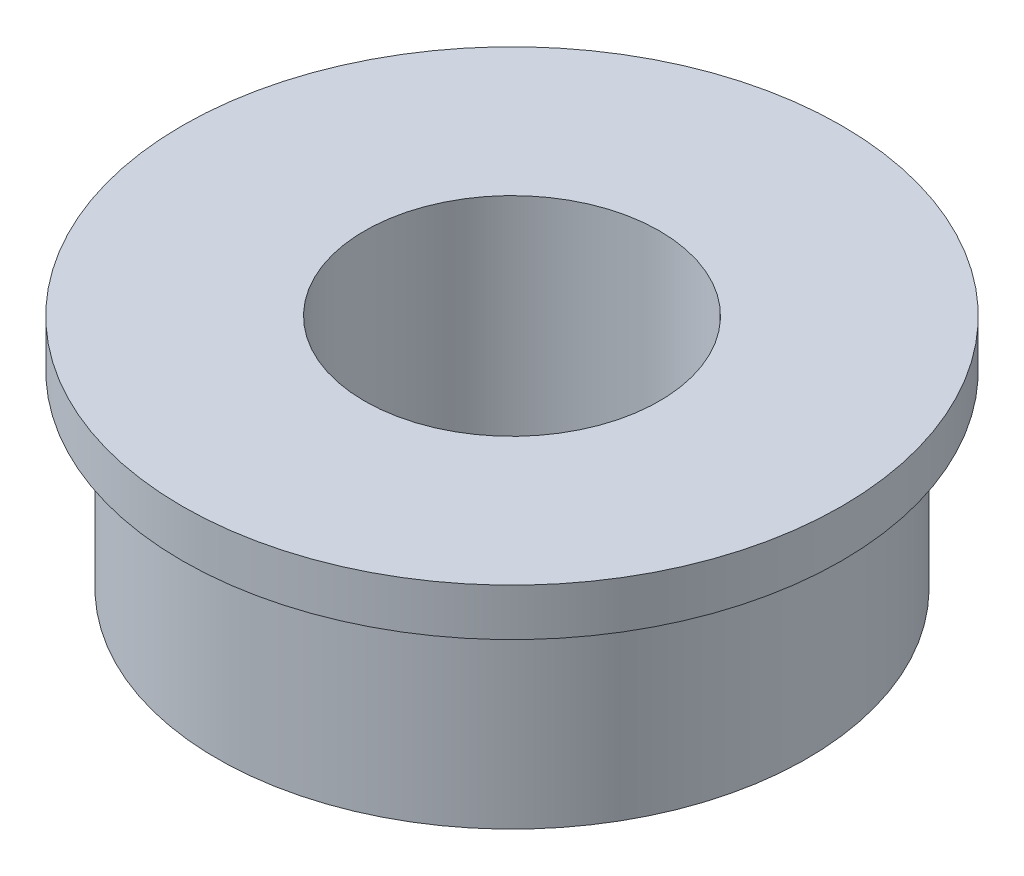
ISO-10303-21;
HEADER;
FILE_DESCRIPTION(('STEP AP214'),'2;1');
FILE_NAME('part.step','',(''),(''),'','','');
FILE_SCHEMA(('AUTOMOTIVE_DESIGN { 1 0 10303 214 1 1 1 1 }'));
ENDSEC;
DATA;
#1=APPLICATION_CONTEXT('core data for automotive mechanical design processes');
#2=APPLICATION_PROTOCOL_DEFINITION('international standard','automotive_design',2000,#1);
#3=PRODUCT_CONTEXT('',#1,'mechanical');
#4=PRODUCT('Part','Part','',(#3));
#5=PRODUCT_RELATED_PRODUCT_CATEGORY('part','',(#4));
#6=PRODUCT_DEFINITION_FORMATION('','',#4);
#7=PRODUCT_DEFINITION_CONTEXT('part definition',#1,'design');
#8=PRODUCT_DEFINITION('design','',#6,#7);
#9=PRODUCT_DEFINITION_SHAPE('','',#8);
#10=(LENGTH_UNIT() NAMED_UNIT(*) SI_UNIT(.MILLI.,.METRE.));
#11=(NAMED_UNIT(*) PLANE_ANGLE_UNIT() SI_UNIT($,.RADIAN.));
#12=(NAMED_UNIT(*) SI_UNIT($,.STERADIAN.) SOLID_ANGLE_UNIT());
#13=UNCERTAINTY_MEASURE_WITH_UNIT(LENGTH_MEASURE(1.E-05),#10,'distance_accuracy_value','');
#14=(GEOMETRIC_REPRESENTATION_CONTEXT(3) GLOBAL_UNCERTAINTY_ASSIGNED_CONTEXT((#13)) GLOBAL_UNIT_ASSIGNED_CONTEXT((#10,
#11,#12)) REPRESENTATION_CONTEXT('',''));
#15=CARTESIAN_POINT('',(0.,0.,0.));
#16=DIRECTION('',(0.,0.,1.));
#17=DIRECTION('',(1.,0.,0.));
#18=AXIS2_PLACEMENT_3D('',#15,#16,#17);
#19=CARTESIAN_POINT('',(5.59,4.,0.));
#20=DIRECTION('',(0.,1.,0.));
#21=DIRECTION('',(0.,0.,1.));
#22=AXIS2_PLACEMENT_3D('',#19,#20,#21);
#23=PLANE('',#22);
#24=CARTESIAN_POINT('',(0.,4.,0.));
#25=DIRECTION('',(0.,-1.,0.));
#26=DIRECTION('',(0.,0.,-1.));
#27=AXIS2_PLACEMENT_3D('',#24,#25,#26);
#28=CIRCLE('',#27,2.5);
#29=CARTESIAN_POINT('',(0.,4.,-2.5));
#30=VERTEX_POINT('',#29);
#31=EDGE_CURVE('E10',#30,#30,#28,.T.);
#32=ORIENTED_EDGE('',*,*,#31,.T.);
#33=EDGE_LOOP('',(#32));
#34=FACE_BOUND('',#33,.T.);
#35=CARTESIAN_POINT('',(0.,4.,0.));
#36=DIRECTION('',(0.,-1.,0.));
#37=DIRECTION('',(0.,0.,-1.));
#38=AXIS2_PLACEMENT_3D('',#35,#36,#37);
#39=CIRCLE('',#38,5.59);
#40=CARTESIAN_POINT('',(0.,4.,-5.59));
#41=VERTEX_POINT('',#40);
#42=EDGE_CURVE('E52',#41,#41,#39,.T.);
#43=ORIENTED_EDGE('',*,*,#42,.F.);
#44=EDGE_LOOP('',(#43));
#45=FACE_BOUND('',#44,.T.);
#46=ADVANCED_FACE('F30',(#34,#45),#23,.T.);
#47=CARTESIAN_POINT('',(0.,0.,0.));
#48=DIRECTION('',(0.,-1.,0.));
#49=DIRECTION('',(0.,0.,-1.));
#50=AXIS2_PLACEMENT_3D('',#47,#48,#49);
#51=CYLINDRICAL_SURFACE('',#50,2.5);
#52=CARTESIAN_POINT('',(0.,0.,0.));
#53=DIRECTION('',(0.,-1.,0.));
#54=DIRECTION('',(0.,0.,-1.));
#55=AXIS2_PLACEMENT_3D('',#52,#53,#54);
#56=CIRCLE('',#55,2.5);
#57=CARTESIAN_POINT('',(0.,0.,-2.5));
#58=VERTEX_POINT('',#57);
#59=EDGE_CURVE('E36',#58,#58,#56,.T.);
#60=ORIENTED_EDGE('',*,*,#59,.T.);
#61=EDGE_LOOP('',(#60));
#62=FACE_BOUND('',#61,.T.);
#63=ORIENTED_EDGE('',*,*,#31,.F.);
#64=EDGE_LOOP('',(#63));
#65=FACE_BOUND('',#64,.T.);
#66=ADVANCED_FACE('F60',(#62,#65),#51,.F.);
#67=CARTESIAN_POINT('',(2.5,0.,0.));
#68=DIRECTION('',(0.,-1.,0.));
#69=DIRECTION('',(0.,0.,-1.));
#70=AXIS2_PLACEMENT_3D('',#67,#68,#69);
#71=PLANE('',#70);
#72=CARTESIAN_POINT('',(0.,0.,0.));
#73=DIRECTION('',(0.,-1.,0.));
#74=DIRECTION('',(0.,0.,-1.));
#75=AXIS2_PLACEMENT_3D('',#72,#73,#74);
#76=CIRCLE('',#75,5.);
#77=CARTESIAN_POINT('',(0.,0.,-5.));
#78=VERTEX_POINT('',#77);
#79=EDGE_CURVE('E40',#78,#78,#76,.T.);
#80=ORIENTED_EDGE('',*,*,#79,.T.);
#81=EDGE_LOOP('',(#80));
#82=FACE_BOUND('',#81,.T.);
#83=ORIENTED_EDGE('',*,*,#59,.F.);
#84=EDGE_LOOP('',(#83));
#85=FACE_BOUND('',#84,.T.);
#86=ADVANCED_FACE('F64',(#82,#85),#71,.T.);
#87=CARTESIAN_POINT('',(0.,0.,0.));
#88=DIRECTION('',(0.,-1.,0.));
#89=DIRECTION('',(0.,0.,-1.));
#90=AXIS2_PLACEMENT_3D('',#87,#88,#89);
#91=CYLINDRICAL_SURFACE('',#90,5.);
#92=CARTESIAN_POINT('',(0.,3.2,0.));
#93=DIRECTION('',(0.,-1.,0.));
#94=DIRECTION('',(0.,0.,-1.));
#95=AXIS2_PLACEMENT_3D('',#92,#93,#94);
#96=CIRCLE('',#95,5.);
#97=CARTESIAN_POINT('',(0.,3.2,-5.));
#98=VERTEX_POINT('',#97);
#99=EDGE_CURVE('E44',#98,#98,#96,.T.);
#100=ORIENTED_EDGE('',*,*,#99,.T.);
#101=EDGE_LOOP('',(#100));
#102=FACE_BOUND('',#101,.T.);
#103=ORIENTED_EDGE('',*,*,#79,.F.);
#104=EDGE_LOOP('',(#103));
#105=FACE_BOUND('',#104,.T.);
#106=ADVANCED_FACE('F68',(#102,#105),#91,.T.);
#107=CARTESIAN_POINT('',(5.,3.2,0.));
#108=DIRECTION('',(0.,-1.,0.));
#109=DIRECTION('',(0.,0.,-1.));
#110=AXIS2_PLACEMENT_3D('',#107,#108,#109);
#111=PLANE('',#110);
#112=CARTESIAN_POINT('',(0.,3.2,0.));
#113=DIRECTION('',(0.,-1.,0.));
#114=DIRECTION('',(0.,0.,-1.));
#115=AXIS2_PLACEMENT_3D('',#112,#113,#114);
#116=CIRCLE('',#115,5.59);
#117=CARTESIAN_POINT('',(0.,3.2,-5.59));
#118=VERTEX_POINT('',#117);
#119=EDGE_CURVE('E49',#118,#118,#116,.T.);
#120=ORIENTED_EDGE('',*,*,#119,.T.);
#121=EDGE_LOOP('',(#120));
#122=FACE_BOUND('',#121,.T.);
#123=ORIENTED_EDGE('',*,*,#99,.F.);
#124=EDGE_LOOP('',(#123));
#125=FACE_BOUND('',#124,.T.);
#126=ADVANCED_FACE('F75',(#122,#125),#111,.T.);
#127=CARTESIAN_POINT('',(0.,0.,0.));
#128=DIRECTION('',(0.,-1.,0.));
#129=DIRECTION('',(0.,0.,-1.));
#130=AXIS2_PLACEMENT_3D('',#127,#128,#129);
#131=CYLINDRICAL_SURFACE('',#130,5.59);
#132=ORIENTED_EDGE('',*,*,#42,.T.);
#133=EDGE_LOOP('',(#132));
#134=FACE_BOUND('',#133,.T.);
#135=ORIENTED_EDGE('',*,*,#119,.F.);
#136=EDGE_LOOP('',(#135));
#137=FACE_BOUND('',#136,.T.);
#138=ADVANCED_FACE('F56',(#134,#137),#131,.T.);
#139=CLOSED_SHELL('',(#46,#66,#86,#106,#126,#138));
#140=MANIFOLD_SOLID_BREP('B2',#139);
#141=ADVANCED_BREP_SHAPE_REPRESENTATION('',(#18,#140),#14);
#142=SHAPE_DEFINITION_REPRESENTATION(#9,#141);
ENDSEC;
END-ISO-10303-21;
